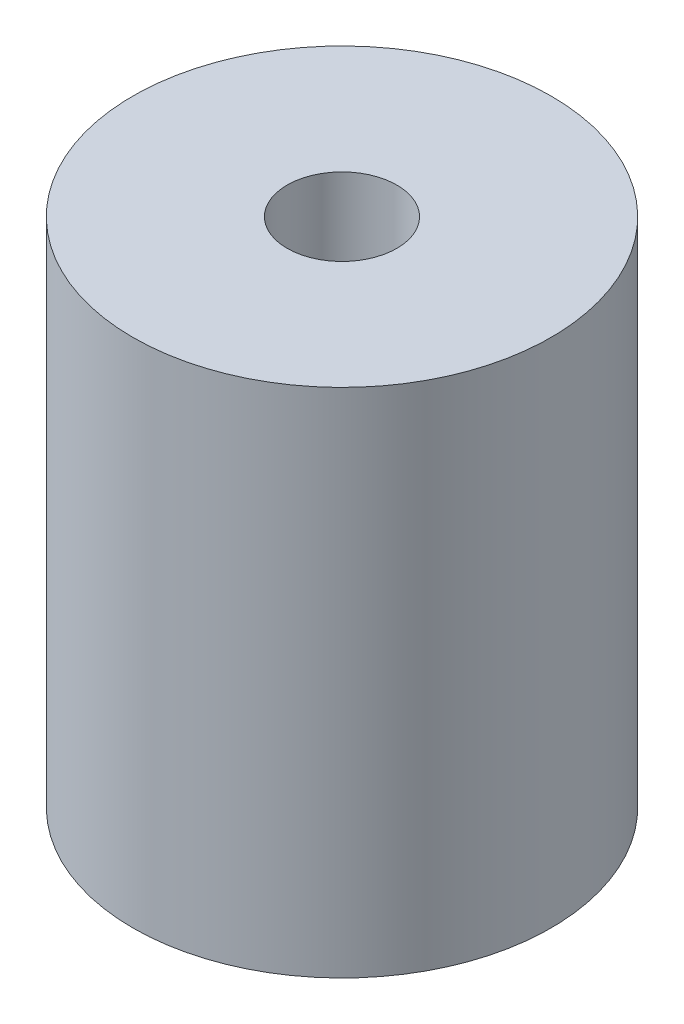
ISO-10303-21;
HEADER;
FILE_DESCRIPTION(('STEP AP214'),'2;1');
FILE_NAME('part.step','',(''),(''),'','','');
FILE_SCHEMA(('AUTOMOTIVE_DESIGN { 1 0 10303 214 1 1 1 1 }'));
ENDSEC;
DATA;
#1=APPLICATION_CONTEXT('core data for automotive mechanical design processes');
#2=APPLICATION_PROTOCOL_DEFINITION('international standard','automotive_design',2000,#1);
#3=PRODUCT_CONTEXT('',#1,'mechanical');
#4=PRODUCT('Part','Part','',(#3));
#5=PRODUCT_RELATED_PRODUCT_CATEGORY('part','',(#4));
#6=PRODUCT_DEFINITION_FORMATION('','',#4);
#7=PRODUCT_DEFINITION_CONTEXT('part definition',#1,'design');
#8=PRODUCT_DEFINITION('design','',#6,#7);
#9=PRODUCT_DEFINITION_SHAPE('','',#8);
#10=(LENGTH_UNIT() NAMED_UNIT(*) SI_UNIT(.MILLI.,.METRE.));
#11=(NAMED_UNIT(*) PLANE_ANGLE_UNIT() SI_UNIT($,.RADIAN.));
#12=(NAMED_UNIT(*) SI_UNIT($,.STERADIAN.) SOLID_ANGLE_UNIT());
#13=UNCERTAINTY_MEASURE_WITH_UNIT(LENGTH_MEASURE(1.E-05),#10,'distance_accuracy_value','');
#14=(GEOMETRIC_REPRESENTATION_CONTEXT(3) GLOBAL_UNCERTAINTY_ASSIGNED_CONTEXT((#13)) GLOBAL_UNIT_ASSIGNED_CONTEXT((#10,
#11,#12)) REPRESENTATION_CONTEXT('',''));
#15=CARTESIAN_POINT('',(0.,0.,0.));
#16=DIRECTION('',(0.,0.,1.));
#17=DIRECTION('',(1.,0.,0.));
#18=AXIS2_PLACEMENT_3D('',#15,#16,#17);
#19=CARTESIAN_POINT('',(0.,23.3,0.));
#20=DIRECTION('',(0.,-1.,0.));
#21=DIRECTION('',(0.,0.,-1.));
#22=AXIS2_PLACEMENT_3D('',#19,#20,#21);
#23=CYLINDRICAL_SURFACE('',#22,9.525);
#24=CARTESIAN_POINT('',(0.,23.3,0.));
#25=DIRECTION('',(0.,1.,0.));
#26=DIRECTION('',(0.,0.,1.));
#27=AXIS2_PLACEMENT_3D('',#24,#25,#26);
#28=CIRCLE('',#27,9.525);
#29=CARTESIAN_POINT('',(0.,23.3,9.525));
#30=VERTEX_POINT('',#29);
#31=EDGE_CURVE('E10',#30,#30,#28,.T.);
#32=ORIENTED_EDGE('',*,*,#31,.F.);
#33=EDGE_LOOP('',(#32));
#34=FACE_BOUND('',#33,.T.);
#35=CARTESIAN_POINT('',(0.,0.,0.));
#36=DIRECTION('',(0.,1.,0.));
#37=DIRECTION('',(0.,0.,1.));
#38=AXIS2_PLACEMENT_3D('',#35,#36,#37);
#39=CIRCLE('',#38,9.525);
#40=CARTESIAN_POINT('',(0.,0.,9.525));
#41=VERTEX_POINT('',#40);
#42=EDGE_CURVE('E34',#41,#41,#39,.T.);
#43=ORIENTED_EDGE('',*,*,#42,.T.);
#44=EDGE_LOOP('',(#43));
#45=FACE_BOUND('',#44,.T.);
#46=ADVANCED_FACE('F31',(#34,#45),#23,.T.);
#47=CARTESIAN_POINT('',(0.,23.3,0.));
#48=DIRECTION('',(0.,1.,0.));
#49=DIRECTION('',(0.,0.,1.));
#50=AXIS2_PLACEMENT_3D('',#47,#48,#49);
#51=PLANE('',#50);
#52=CARTESIAN_POINT('',(0.,23.3,0.));
#53=DIRECTION('',(0.,1.,0.));
#54=DIRECTION('',(0.,0.,1.));
#55=AXIS2_PLACEMENT_3D('',#52,#53,#54);
#56=CIRCLE('',#55,2.49999999999999);
#57=CARTESIAN_POINT('',(0.,23.3,2.49999999999999));
#58=VERTEX_POINT('',#57);
#59=EDGE_CURVE('E45',#58,#58,#56,.T.);
#60=ORIENTED_EDGE('',*,*,#59,.F.);
#61=EDGE_LOOP('',(#60));
#62=FACE_BOUND('',#61,.T.);
#63=ORIENTED_EDGE('',*,*,#31,.T.);
#64=EDGE_LOOP('',(#63));
#65=FACE_BOUND('',#64,.T.);
#66=ADVANCED_FACE('F51',(#62,#65),#51,.T.);
#67=CARTESIAN_POINT('',(0.,0.,0.));
#68=DIRECTION('',(0.,1.,0.));
#69=DIRECTION('',(0.,0.,1.));
#70=AXIS2_PLACEMENT_3D('',#67,#68,#69);
#71=PLANE('',#70);
#72=CARTESIAN_POINT('',(0.,0.,0.));
#73=DIRECTION('',(0.,1.,0.));
#74=DIRECTION('',(0.,0.,1.));
#75=AXIS2_PLACEMENT_3D('',#72,#73,#74);
#76=CIRCLE('',#75,2.5);
#77=CARTESIAN_POINT('',(0.,0.,2.5));
#78=VERTEX_POINT('',#77);
#79=EDGE_CURVE('E41',#78,#78,#76,.T.);
#80=ORIENTED_EDGE('',*,*,#79,.T.);
#81=EDGE_LOOP('',(#80));
#82=FACE_BOUND('',#81,.T.);
#83=ORIENTED_EDGE('',*,*,#42,.F.);
#84=EDGE_LOOP('',(#83));
#85=FACE_BOUND('',#84,.T.);
#86=ADVANCED_FACE('F53',(#82,#85),#71,.F.);
#87=CARTESIAN_POINT('',(0.,23.3,0.));
#88=DIRECTION('',(0.,1.,0.));
#89=DIRECTION('',(0.,0.,1.));
#90=AXIS2_PLACEMENT_3D('',#87,#88,#89);
#91=CYLINDRICAL_SURFACE('',#90,2.49999999999999);
#92=ORIENTED_EDGE('',*,*,#79,.F.);
#93=EDGE_LOOP('',(#92));
#94=FACE_BOUND('',#93,.T.);
#95=ORIENTED_EDGE('',*,*,#59,.T.);
#96=EDGE_LOOP('',(#95));
#97=FACE_BOUND('',#96,.T.);
#98=ADVANCED_FACE('F49',(#94,#97),#91,.F.);
#99=CLOSED_SHELL('',(#46,#66,#86,#98));
#100=MANIFOLD_SOLID_BREP('B2',#99);
#101=ADVANCED_BREP_SHAPE_REPRESENTATION('',(#18,#100),#14);
#102=SHAPE_DEFINITION_REPRESENTATION(#9,#101);
ENDSEC;
END-ISO-10303-21;
